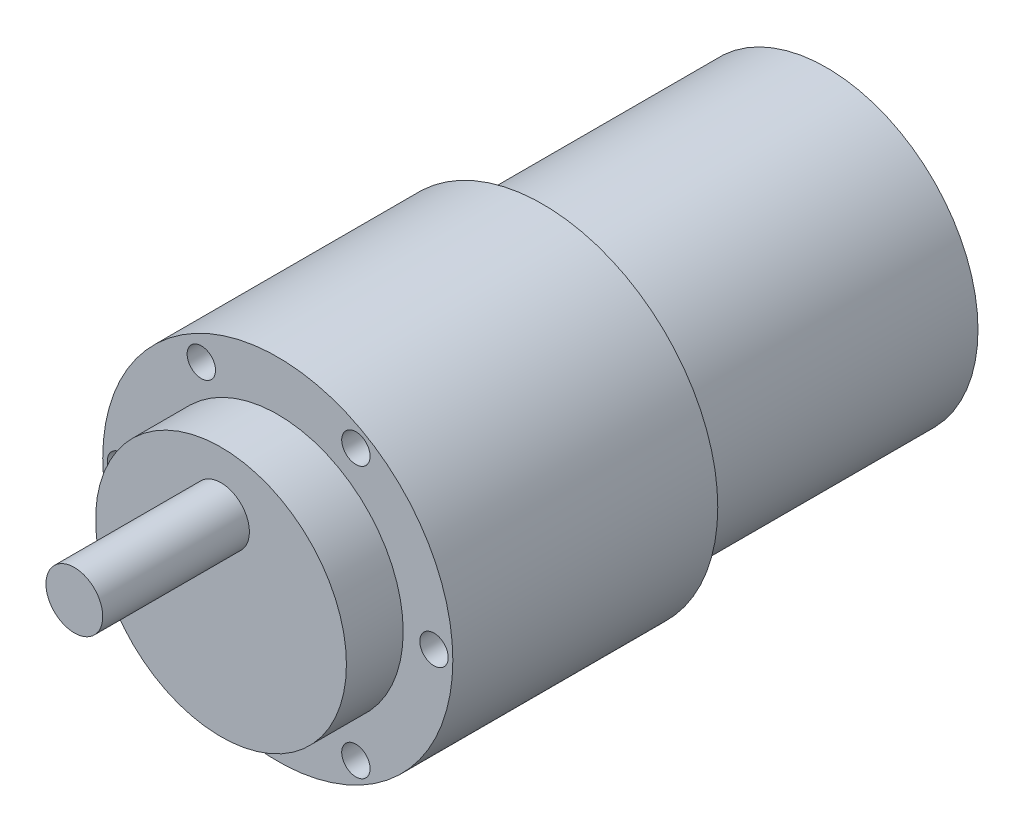
ISO-10303-21;
HEADER;
FILE_DESCRIPTION(('STEP AP214'),'2;1');
FILE_NAME('part.step','',(''),(''),'','','');
FILE_SCHEMA(('AUTOMOTIVE_DESIGN { 1 0 10303 214 1 1 1 1 }'));
ENDSEC;
DATA;
#1=APPLICATION_CONTEXT('core data for automotive mechanical design processes');
#2=APPLICATION_PROTOCOL_DEFINITION('international standard','automotive_design',2000,#1);
#3=PRODUCT_CONTEXT('',#1,'mechanical');
#4=PRODUCT('Part','Part','',(#3));
#5=PRODUCT_RELATED_PRODUCT_CATEGORY('part','',(#4));
#6=PRODUCT_DEFINITION_FORMATION('','',#4);
#7=PRODUCT_DEFINITION_CONTEXT('part definition',#1,'design');
#8=PRODUCT_DEFINITION('design','',#6,#7);
#9=PRODUCT_DEFINITION_SHAPE('','',#8);
#10=(LENGTH_UNIT() NAMED_UNIT(*) SI_UNIT(.MILLI.,.METRE.));
#11=(NAMED_UNIT(*) PLANE_ANGLE_UNIT() SI_UNIT($,.RADIAN.));
#12=(NAMED_UNIT(*) SI_UNIT($,.STERADIAN.) SOLID_ANGLE_UNIT());
#13=UNCERTAINTY_MEASURE_WITH_UNIT(LENGTH_MEASURE(1.E-05),#10,'distance_accuracy_value','');
#14=(GEOMETRIC_REPRESENTATION_CONTEXT(3) GLOBAL_UNCERTAINTY_ASSIGNED_CONTEXT((#13)) GLOBAL_UNIT_ASSIGNED_CONTEXT((#10,
#11,#12)) REPRESENTATION_CONTEXT('',''));
#15=CARTESIAN_POINT('',(0.,0.,0.));
#16=DIRECTION('',(0.,0.,1.));
#17=DIRECTION('',(1.,0.,0.));
#18=AXIS2_PLACEMENT_3D('',#15,#16,#17);
#19=CARTESIAN_POINT('',(0.,0.,30.));
#20=DIRECTION('',(0.,0.,-1.));
#21=DIRECTION('',(-1.,0.,0.));
#22=AXIS2_PLACEMENT_3D('',#19,#20,#21);
#23=CYLINDRICAL_SURFACE('',#22,16.);
#24=CARTESIAN_POINT('',(0.,0.,30.));
#25=DIRECTION('',(0.,0.,1.));
#26=DIRECTION('',(1.,0.,0.));
#27=AXIS2_PLACEMENT_3D('',#24,#25,#26);
#28=CIRCLE('',#27,16.);
#29=CARTESIAN_POINT('',(16.,0.,30.));
#30=VERTEX_POINT('',#29);
#31=EDGE_CURVE('E42',#30,#30,#28,.T.);
#32=ORIENTED_EDGE('',*,*,#31,.F.);
#33=EDGE_LOOP('',(#32));
#34=FACE_BOUND('',#33,.T.);
#35=CARTESIAN_POINT('',(0.,0.,0.));
#36=DIRECTION('',(0.,0.,1.));
#37=DIRECTION('',(1.,0.,0.));
#38=AXIS2_PLACEMENT_3D('',#35,#36,#37);
#39=CIRCLE('',#38,16.);
#40=CARTESIAN_POINT('',(16.,0.,0.));
#41=VERTEX_POINT('',#40);
#42=EDGE_CURVE('E37',#41,#41,#39,.T.);
#43=ORIENTED_EDGE('',*,*,#42,.T.);
#44=EDGE_LOOP('',(#43));
#45=FACE_BOUND('',#44,.T.);
#46=ADVANCED_FACE('F34',(#34,#45),#23,.T.);
#47=CARTESIAN_POINT('',(0.,0.,0.));
#48=DIRECTION('',(0.,0.,1.));
#49=DIRECTION('',(1.,0.,0.));
#50=AXIS2_PLACEMENT_3D('',#47,#48,#49);
#51=PLANE('',#50);
#52=ORIENTED_EDGE('',*,*,#42,.F.);
#53=EDGE_LOOP('',(#52));
#54=FACE_BOUND('',#53,.T.);
#55=ADVANCED_FACE('F128',(#54),#51,.F.);
#56=CARTESIAN_POINT('',(0.,0.,58.));
#57=DIRECTION('',(0.,0.,-1.));
#58=DIRECTION('',(-1.,0.,0.));
#59=AXIS2_PLACEMENT_3D('',#56,#57,#58);
#60=CYLINDRICAL_SURFACE('',#59,18.5);
#61=CARTESIAN_POINT('',(0.,0.,58.));
#62=DIRECTION('',(0.,0.,1.));
#63=DIRECTION('',(1.,0.,0.));
#64=AXIS2_PLACEMENT_3D('',#61,#62,#63);
#65=CIRCLE('',#64,18.5);
#66=CARTESIAN_POINT('',(18.5,0.,58.));
#67=VERTEX_POINT('',#66);
#68=EDGE_CURVE('E117',#67,#67,#65,.T.);
#69=ORIENTED_EDGE('',*,*,#68,.F.);
#70=EDGE_LOOP('',(#69));
#71=FACE_BOUND('',#70,.T.);
#72=CARTESIAN_POINT('',(0.,0.,30.));
#73=DIRECTION('',(0.,0.,1.));
#74=DIRECTION('',(1.,0.,0.));
#75=AXIS2_PLACEMENT_3D('',#72,#73,#74);
#76=CIRCLE('',#75,18.5);
#77=CARTESIAN_POINT('',(18.5,0.,30.));
#78=VERTEX_POINT('',#77);
#79=EDGE_CURVE('E115',#78,#78,#76,.T.);
#80=ORIENTED_EDGE('',*,*,#79,.T.);
#81=EDGE_LOOP('',(#80));
#82=FACE_BOUND('',#81,.T.);
#83=ADVANCED_FACE('F130',(#71,#82),#60,.T.);
#84=CARTESIAN_POINT('',(0.,0.,58.));
#85=DIRECTION('',(0.,0.,1.));
#86=DIRECTION('',(1.,0.,0.));
#87=AXIS2_PLACEMENT_3D('',#84,#85,#86);
#88=PLANE('',#87);
#89=CARTESIAN_POINT('',(-8.07919942078451,13.9935838812799,58.));
#90=DIRECTION('',(0.,0.,1.));
#91=DIRECTION('',(1.,0.,0.));
#92=AXIS2_PLACEMENT_3D('',#89,#90,#91);
#93=CIRCLE('',#92,1.49999999999999);
#94=CARTESIAN_POINT('',(-6.57919942078452,13.9935838812799,58.));
#95=VERTEX_POINT('',#94);
#96=EDGE_CURVE('E73',#95,#95,#93,.T.);
#97=ORIENTED_EDGE('',*,*,#96,.F.);
#98=EDGE_LOOP('',(#97));
#99=FACE_BOUND('',#98,.T.);
#100=CARTESIAN_POINT('',(-16.51,0.,58.));
#101=DIRECTION('',(0.,0.,1.));
#102=DIRECTION('',(1.,0.,0.));
#103=AXIS2_PLACEMENT_3D('',#100,#101,#102);
#104=CIRCLE('',#103,1.49999999999999);
#105=CARTESIAN_POINT('',(-15.01,0.,58.));
#106=VERTEX_POINT('',#105);
#107=EDGE_CURVE('E72',#106,#106,#104,.T.);
#108=ORIENTED_EDGE('',*,*,#107,.F.);
#109=EDGE_LOOP('',(#108));
#110=FACE_BOUND('',#109,.T.);
#111=CARTESIAN_POINT('',(8.25500000000007,-14.298079416481,58.));
#112=DIRECTION('',(0.,0.,1.));
#113=DIRECTION('',(1.,0.,0.));
#114=AXIS2_PLACEMENT_3D('',#111,#112,#113);
#115=CIRCLE('',#114,1.49999999999999);
#116=CARTESIAN_POINT('',(9.75500000000006,-14.298079416481,58.));
#117=VERTEX_POINT('',#116);
#118=EDGE_CURVE('E83',#117,#117,#115,.T.);
#119=ORIENTED_EDGE('',*,*,#118,.F.);
#120=EDGE_LOOP('',(#119));
#121=FACE_BOUND('',#120,.T.);
#122=CARTESIAN_POINT('',(-8.25499999999996,-14.2980794164811,58.));
#123=DIRECTION('',(0.,0.,1.));
#124=DIRECTION('',(1.,0.,0.));
#125=AXIS2_PLACEMENT_3D('',#122,#123,#124);
#126=CIRCLE('',#125,1.49999999999999);
#127=CARTESIAN_POINT('',(-6.75499999999997,-14.2980794164811,58.));
#128=VERTEX_POINT('',#127);
#129=EDGE_CURVE('E89',#128,#128,#126,.T.);
#130=ORIENTED_EDGE('',*,*,#129,.F.);
#131=EDGE_LOOP('',(#130));
#132=FACE_BOUND('',#131,.T.);
#133=CARTESIAN_POINT('',(8.25500000000006,14.298079416481,58.));
#134=DIRECTION('',(0.,0.,1.));
#135=DIRECTION('',(1.,0.,0.));
#136=AXIS2_PLACEMENT_3D('',#133,#134,#135);
#137=CIRCLE('',#136,1.49999999999999);
#138=CARTESIAN_POINT('',(9.75500000000005,14.298079416481,58.));
#139=VERTEX_POINT('',#138);
#140=EDGE_CURVE('E95',#139,#139,#137,.T.);
#141=ORIENTED_EDGE('',*,*,#140,.F.);
#142=EDGE_LOOP('',(#141));
#143=FACE_BOUND('',#142,.T.);
#144=CARTESIAN_POINT('',(16.51,0.,58.));
#145=DIRECTION('',(0.,0.,1.));
#146=DIRECTION('',(1.,0.,0.));
#147=AXIS2_PLACEMENT_3D('',#144,#145,#146);
#148=CIRCLE('',#147,1.49999999999999);
#149=CARTESIAN_POINT('',(18.01,0.,58.));
#150=VERTEX_POINT('',#149);
#151=EDGE_CURVE('E101',#150,#150,#148,.T.);
#152=ORIENTED_EDGE('',*,*,#151,.F.);
#153=EDGE_LOOP('',(#152));
#154=FACE_BOUND('',#153,.T.);
#155=CARTESIAN_POINT('',(0.,0.,58.));
#156=DIRECTION('',(0.,0.,1.));
#157=DIRECTION('',(1.,0.,0.));
#158=AXIS2_PLACEMENT_3D('',#155,#156,#157);
#159=CIRCLE('',#158,13.2553839928777);
#160=CARTESIAN_POINT('',(13.2553839928777,0.,58.));
#161=VERTEX_POINT('',#160);
#162=EDGE_CURVE('E11',#161,#161,#159,.T.);
#163=ORIENTED_EDGE('',*,*,#162,.F.);
#164=EDGE_LOOP('',(#163));
#165=FACE_BOUND('',#164,.T.);
#166=ORIENTED_EDGE('',*,*,#68,.T.);
#167=EDGE_LOOP('',(#166));
#168=FACE_BOUND('',#167,.T.);
#169=ADVANCED_FACE('F135',(#99,#110,#121,#132,#143,#154,#165,#168),#88,.T.);
#170=CARTESIAN_POINT('',(0.,0.,30.));
#171=DIRECTION('',(0.,0.,1.));
#172=DIRECTION('',(1.,0.,0.));
#173=AXIS2_PLACEMENT_3D('',#170,#171,#172);
#174=PLANE('',#173);
#175=ORIENTED_EDGE('',*,*,#31,.T.);
#176=EDGE_LOOP('',(#175));
#177=FACE_BOUND('',#176,.T.);
#178=ORIENTED_EDGE('',*,*,#79,.F.);
#179=EDGE_LOOP('',(#178));
#180=FACE_BOUND('',#179,.T.);
#181=ADVANCED_FACE('F140',(#177,#180),#174,.F.);
#182=CARTESIAN_POINT('',(0.,0.,64.));
#183=DIRECTION('',(0.,0.,-1.));
#184=DIRECTION('',(-1.,0.,0.));
#185=AXIS2_PLACEMENT_3D('',#182,#183,#184);
#186=CYLINDRICAL_SURFACE('',#185,13.2553839928777);
#187=CARTESIAN_POINT('',(0.,0.,64.));
#188=DIRECTION('',(0.,0.,1.));
#189=DIRECTION('',(1.,0.,0.));
#190=AXIS2_PLACEMENT_3D('',#187,#188,#189);
#191=CIRCLE('',#190,13.2553839928777);
#192=CARTESIAN_POINT('',(13.2553839928777,0.,64.));
#193=VERTEX_POINT('',#192);
#194=EDGE_CURVE('E111',#193,#193,#191,.T.);
#195=ORIENTED_EDGE('',*,*,#194,.F.);
#196=EDGE_LOOP('',(#195));
#197=FACE_BOUND('',#196,.T.);
#198=ORIENTED_EDGE('',*,*,#162,.T.);
#199=EDGE_LOOP('',(#198));
#200=FACE_BOUND('',#199,.T.);
#201=ADVANCED_FACE('F143',(#197,#200),#186,.T.);
#202=CARTESIAN_POINT('',(0.,0.,64.));
#203=DIRECTION('',(0.,0.,1.));
#204=DIRECTION('',(1.,0.,0.));
#205=AXIS2_PLACEMENT_3D('',#202,#203,#204);
#206=PLANE('',#205);
#207=CARTESIAN_POINT('',(0.,7.,64.));
#208=DIRECTION('',(0.,0.,1.));
#209=DIRECTION('',(1.,0.,0.));
#210=AXIS2_PLACEMENT_3D('',#207,#208,#209);
#211=CIRCLE('',#210,3.);
#212=CARTESIAN_POINT('',(3.,7.,64.));
#213=VERTEX_POINT('',#212);
#214=EDGE_CURVE('E107',#213,#213,#211,.T.);
#215=ORIENTED_EDGE('',*,*,#214,.F.);
#216=EDGE_LOOP('',(#215));
#217=FACE_BOUND('',#216,.T.);
#218=ORIENTED_EDGE('',*,*,#194,.T.);
#219=EDGE_LOOP('',(#218));
#220=FACE_BOUND('',#219,.T.);
#221=ADVANCED_FACE('F149',(#217,#220),#206,.T.);
#222=CARTESIAN_POINT('',(0.,7.,79.5));
#223=DIRECTION('',(0.,0.,-1.));
#224=DIRECTION('',(-1.,0.,0.));
#225=AXIS2_PLACEMENT_3D('',#222,#223,#224);
#226=CYLINDRICAL_SURFACE('',#225,3.);
#227=CARTESIAN_POINT('',(0.,7.,79.5));
#228=DIRECTION('',(0.,0.,1.));
#229=DIRECTION('',(1.,0.,0.));
#230=AXIS2_PLACEMENT_3D('',#227,#228,#229);
#231=CIRCLE('',#230,3.);
#232=CARTESIAN_POINT('',(3.,7.,79.5));
#233=VERTEX_POINT('',#232);
#234=EDGE_CURVE('E108',#233,#233,#231,.T.);
#235=ORIENTED_EDGE('',*,*,#234,.F.);
#236=EDGE_LOOP('',(#235));
#237=FACE_BOUND('',#236,.T.);
#238=ORIENTED_EDGE('',*,*,#214,.T.);
#239=EDGE_LOOP('',(#238));
#240=FACE_BOUND('',#239,.T.);
#241=ADVANCED_FACE('F153',(#237,#240),#226,.T.);
#242=CARTESIAN_POINT('',(0.,7.,79.5));
#243=DIRECTION('',(0.,0.,1.));
#244=DIRECTION('',(1.,0.,0.));
#245=AXIS2_PLACEMENT_3D('',#242,#243,#244);
#246=PLANE('',#245);
#247=ORIENTED_EDGE('',*,*,#234,.T.);
#248=EDGE_LOOP('',(#247));
#249=FACE_BOUND('',#248,.T.);
#250=ADVANCED_FACE('F157',(#249),#246,.T.);
#251=CARTESIAN_POINT('',(16.51,0.,54.444));
#252=DIRECTION('',(0.,0.,1.));
#253=DIRECTION('',(1.,0.,0.));
#254=AXIS2_PLACEMENT_3D('',#251,#252,#253);
#255=CONICAL_SURFACE('',#254,1.49999999999999,1.02974425867665);
#256=CARTESIAN_POINT('',(16.51,0.,53.5427090714587));
#257=VERTEX_POINT('',#256);
#258=VERTEX_LOOP('',#257);
#259=FACE_BOUND('',#258,.T.);
#260=CARTESIAN_POINT('',(16.51,0.,54.444));
#261=DIRECTION('',(0.,0.,1.));
#262=DIRECTION('',(1.,0.,0.));
#263=AXIS2_PLACEMENT_3D('',#260,#261,#262);
#264=CIRCLE('',#263,1.49999999999999);
#265=CARTESIAN_POINT('',(18.01,0.,54.444));
#266=VERTEX_POINT('',#265);
#267=EDGE_CURVE('E104',#266,#266,#264,.T.);
#268=ORIENTED_EDGE('',*,*,#267,.T.);
#269=EDGE_LOOP('',(#268));
#270=FACE_BOUND('',#269,.T.);
#271=ADVANCED_FACE('F161',(#259,#270),#255,.F.);
#272=CARTESIAN_POINT('',(16.51,0.,58.));
#273=DIRECTION('',(0.,0.,1.));
#274=DIRECTION('',(1.,0.,0.));
#275=AXIS2_PLACEMENT_3D('',#272,#273,#274);
#276=CYLINDRICAL_SURFACE('',#275,1.49999999999999);
#277=ORIENTED_EDGE('',*,*,#267,.F.);
#278=EDGE_LOOP('',(#277));
#279=FACE_BOUND('',#278,.T.);
#280=ORIENTED_EDGE('',*,*,#151,.T.);
#281=EDGE_LOOP('',(#280));
#282=FACE_BOUND('',#281,.T.);
#283=ADVANCED_FACE('F165',(#279,#282),#276,.F.);
#284=CARTESIAN_POINT('',(8.25500000000006,14.298079416481,54.444));
#285=DIRECTION('',(0.,0.,1.));
#286=DIRECTION('',(1.,0.,0.));
#287=AXIS2_PLACEMENT_3D('',#284,#285,#286);
#288=CONICAL_SURFACE('',#287,1.49999999999999,1.02974425867665);
#289=CARTESIAN_POINT('',(8.25500000000006,14.298079416481,53.5427090714587));
#290=VERTEX_POINT('',#289);
#291=VERTEX_LOOP('',#290);
#292=FACE_BOUND('',#291,.T.);
#293=CARTESIAN_POINT('',(8.25500000000006,14.298079416481,54.444));
#294=DIRECTION('',(0.,0.,1.));
#295=DIRECTION('',(1.,0.,0.));
#296=AXIS2_PLACEMENT_3D('',#293,#294,#295);
#297=CIRCLE('',#296,1.49999999999999);
#298=CARTESIAN_POINT('',(9.75500000000005,14.298079416481,54.444));
#299=VERTEX_POINT('',#298);
#300=EDGE_CURVE('E98',#299,#299,#297,.T.);
#301=ORIENTED_EDGE('',*,*,#300,.T.);
#302=EDGE_LOOP('',(#301));
#303=FACE_BOUND('',#302,.T.);
#304=ADVANCED_FACE('F168',(#292,#303),#288,.F.);
#305=CARTESIAN_POINT('',(8.25500000000006,14.298079416481,58.));
#306=DIRECTION('',(0.,0.,1.));
#307=DIRECTION('',(1.,0.,0.));
#308=AXIS2_PLACEMENT_3D('',#305,#306,#307);
#309=CYLINDRICAL_SURFACE('',#308,1.49999999999999);
#310=ORIENTED_EDGE('',*,*,#300,.F.);
#311=EDGE_LOOP('',(#310));
#312=FACE_BOUND('',#311,.T.);
#313=ORIENTED_EDGE('',*,*,#140,.T.);
#314=EDGE_LOOP('',(#313));
#315=FACE_BOUND('',#314,.T.);
#316=ADVANCED_FACE('F172',(#312,#315),#309,.F.);
#317=CARTESIAN_POINT('',(-8.25499999999996,-14.2980794164811,54.444));
#318=DIRECTION('',(0.,0.,1.));
#319=DIRECTION('',(1.,0.,0.));
#320=AXIS2_PLACEMENT_3D('',#317,#318,#319);
#321=CONICAL_SURFACE('',#320,1.49999999999999,1.02974425867665);
#322=CARTESIAN_POINT('',(-8.25499999999996,-14.2980794164811,53.5427090714587));
#323=VERTEX_POINT('',#322);
#324=VERTEX_LOOP('',#323);
#325=FACE_BOUND('',#324,.T.);
#326=CARTESIAN_POINT('',(-8.25499999999996,-14.2980794164811,54.444));
#327=DIRECTION('',(0.,0.,1.));
#328=DIRECTION('',(1.,0.,0.));
#329=AXIS2_PLACEMENT_3D('',#326,#327,#328);
#330=CIRCLE('',#329,1.49999999999999);
#331=CARTESIAN_POINT('',(-6.75499999999997,-14.2980794164811,54.444));
#332=VERTEX_POINT('',#331);
#333=EDGE_CURVE('E92',#332,#332,#330,.T.);
#334=ORIENTED_EDGE('',*,*,#333,.T.);
#335=EDGE_LOOP('',(#334));
#336=FACE_BOUND('',#335,.T.);
#337=ADVANCED_FACE('F175',(#325,#336),#321,.F.);
#338=CARTESIAN_POINT('',(-8.25499999999996,-14.2980794164811,58.));
#339=DIRECTION('',(0.,0.,1.));
#340=DIRECTION('',(1.,0.,0.));
#341=AXIS2_PLACEMENT_3D('',#338,#339,#340);
#342=CYLINDRICAL_SURFACE('',#341,1.49999999999999);
#343=ORIENTED_EDGE('',*,*,#333,.F.);
#344=EDGE_LOOP('',(#343));
#345=FACE_BOUND('',#344,.T.);
#346=ORIENTED_EDGE('',*,*,#129,.T.);
#347=EDGE_LOOP('',(#346));
#348=FACE_BOUND('',#347,.T.);
#349=ADVANCED_FACE('F179',(#345,#348),#342,.F.);
#350=CARTESIAN_POINT('',(8.25500000000007,-14.298079416481,54.444));
#351=DIRECTION('',(0.,0.,1.));
#352=DIRECTION('',(1.,0.,0.));
#353=AXIS2_PLACEMENT_3D('',#350,#351,#352);
#354=CONICAL_SURFACE('',#353,1.49999999999999,1.02974425867665);
#355=CARTESIAN_POINT('',(8.25500000000007,-14.298079416481,53.5427090714587));
#356=VERTEX_POINT('',#355);
#357=VERTEX_LOOP('',#356);
#358=FACE_BOUND('',#357,.T.);
#359=CARTESIAN_POINT('',(8.25500000000007,-14.298079416481,54.444));
#360=DIRECTION('',(0.,0.,1.));
#361=DIRECTION('',(1.,0.,0.));
#362=AXIS2_PLACEMENT_3D('',#359,#360,#361);
#363=CIRCLE('',#362,1.49999999999999);
#364=CARTESIAN_POINT('',(9.75500000000006,-14.298079416481,54.444));
#365=VERTEX_POINT('',#364);
#366=EDGE_CURVE('E86',#365,#365,#363,.T.);
#367=ORIENTED_EDGE('',*,*,#366,.T.);
#368=EDGE_LOOP('',(#367));
#369=FACE_BOUND('',#368,.T.);
#370=ADVANCED_FACE('F183',(#358,#369),#354,.F.);
#371=CARTESIAN_POINT('',(8.25500000000007,-14.298079416481,58.));
#372=DIRECTION('',(0.,0.,1.));
#373=DIRECTION('',(1.,0.,0.));
#374=AXIS2_PLACEMENT_3D('',#371,#372,#373);
#375=CYLINDRICAL_SURFACE('',#374,1.49999999999999);
#376=ORIENTED_EDGE('',*,*,#366,.F.);
#377=EDGE_LOOP('',(#376));
#378=FACE_BOUND('',#377,.T.);
#379=ORIENTED_EDGE('',*,*,#118,.T.);
#380=EDGE_LOOP('',(#379));
#381=FACE_BOUND('',#380,.T.);
#382=ADVANCED_FACE('F187',(#378,#381),#375,.F.);
#383=CARTESIAN_POINT('',(-16.51,0.,54.444));
#384=DIRECTION('',(0.,0.,1.));
#385=DIRECTION('',(1.,0.,0.));
#386=AXIS2_PLACEMENT_3D('',#383,#384,#385);
#387=CONICAL_SURFACE('',#386,1.49999999999999,1.02974425867665);
#388=CARTESIAN_POINT('',(-16.51,0.,53.5427090714587));
#389=VERTEX_POINT('',#388);
#390=VERTEX_LOOP('',#389);
#391=FACE_BOUND('',#390,.T.);
#392=CARTESIAN_POINT('',(-16.51,0.,54.444));
#393=DIRECTION('',(0.,0.,1.));
#394=DIRECTION('',(1.,0.,0.));
#395=AXIS2_PLACEMENT_3D('',#392,#393,#394);
#396=CIRCLE('',#395,1.49999999999999);
#397=CARTESIAN_POINT('',(-15.01,0.,54.444));
#398=VERTEX_POINT('',#397);
#399=EDGE_CURVE('E76',#398,#398,#396,.T.);
#400=ORIENTED_EDGE('',*,*,#399,.T.);
#401=EDGE_LOOP('',(#400));
#402=FACE_BOUND('',#401,.T.);
#403=ADVANCED_FACE('F191',(#391,#402),#387,.F.);
#404=CARTESIAN_POINT('',(-16.51,0.,58.));
#405=DIRECTION('',(0.,0.,1.));
#406=DIRECTION('',(1.,0.,0.));
#407=AXIS2_PLACEMENT_3D('',#404,#405,#406);
#408=CYLINDRICAL_SURFACE('',#407,1.49999999999999);
#409=ORIENTED_EDGE('',*,*,#399,.F.);
#410=EDGE_LOOP('',(#409));
#411=FACE_BOUND('',#410,.T.);
#412=ORIENTED_EDGE('',*,*,#107,.T.);
#413=EDGE_LOOP('',(#412));
#414=FACE_BOUND('',#413,.T.);
#415=ADVANCED_FACE('F66',(#411,#414),#408,.F.);
#416=CARTESIAN_POINT('',(-8.07919942078451,13.9935838812799,54.444));
#417=DIRECTION('',(0.,0.,1.));
#418=DIRECTION('',(1.,0.,0.));
#419=AXIS2_PLACEMENT_3D('',#416,#417,#418);
#420=CONICAL_SURFACE('',#419,1.49999999999999,1.02974425867665);
#421=CARTESIAN_POINT('',(-8.07919942078451,13.9935838812799,53.5427090714587));
#422=VERTEX_POINT('',#421);
#423=VERTEX_LOOP('',#422);
#424=FACE_BOUND('',#423,.T.);
#425=CARTESIAN_POINT('',(-8.07919942078451,13.9935838812799,54.444));
#426=DIRECTION('',(0.,0.,1.));
#427=DIRECTION('',(1.,0.,0.));
#428=AXIS2_PLACEMENT_3D('',#425,#426,#427);
#429=CIRCLE('',#428,1.49999999999999);
#430=CARTESIAN_POINT('',(-6.57919942078452,13.9935838812799,54.444));
#431=VERTEX_POINT('',#430);
#432=EDGE_CURVE('E70',#431,#431,#429,.T.);
#433=ORIENTED_EDGE('',*,*,#432,.T.);
#434=EDGE_LOOP('',(#433));
#435=FACE_BOUND('',#434,.T.);
#436=ADVANCED_FACE('F62',(#424,#435),#420,.F.);
#437=CARTESIAN_POINT('',(-8.07919942078451,13.9935838812799,58.));
#438=DIRECTION('',(0.,0.,1.));
#439=DIRECTION('',(1.,0.,0.));
#440=AXIS2_PLACEMENT_3D('',#437,#438,#439);
#441=CYLINDRICAL_SURFACE('',#440,1.49999999999999);
#442=ORIENTED_EDGE('',*,*,#432,.F.);
#443=EDGE_LOOP('',(#442));
#444=FACE_BOUND('',#443,.T.);
#445=ORIENTED_EDGE('',*,*,#96,.T.);
#446=EDGE_LOOP('',(#445));
#447=FACE_BOUND('',#446,.T.);
#448=ADVANCED_FACE('F65',(#444,#447),#441,.F.);
#449=CLOSED_SHELL('',(#46,#55,#83,#169,#181,#201,#221,#241,#250,#271,#283,#304,#316,#337,#349,
#370,#382,#403,#415,#436,#448));
#450=MANIFOLD_SOLID_BREP('B2',#449);
#451=ADVANCED_BREP_SHAPE_REPRESENTATION('',(#18,#450),#14);
#452=SHAPE_DEFINITION_REPRESENTATION(#9,#451);
ENDSEC;
END-ISO-10303-21;
